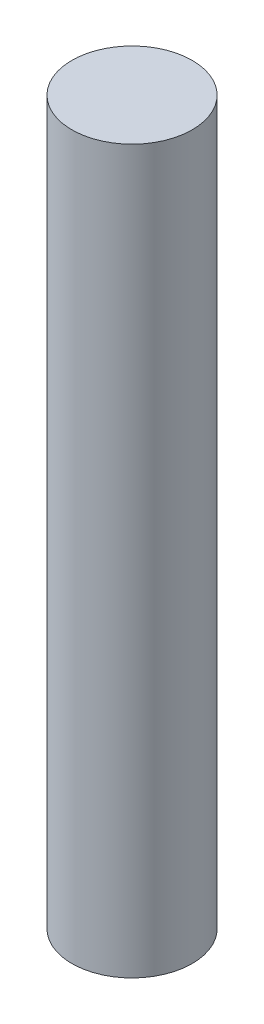
ISO-10303-21;
HEADER;
FILE_DESCRIPTION(('STEP AP214'),'2;1');
FILE_NAME('part.step','',(''),(''),'','','');
FILE_SCHEMA(('AUTOMOTIVE_DESIGN { 1 0 10303 214 1 1 1 1 }'));
ENDSEC;
DATA;
#1=APPLICATION_CONTEXT('core data for automotive mechanical design processes');
#2=APPLICATION_PROTOCOL_DEFINITION('international standard','automotive_design',2000,#1);
#3=PRODUCT_CONTEXT('',#1,'mechanical');
#4=PRODUCT('Part','Part','',(#3));
#5=PRODUCT_RELATED_PRODUCT_CATEGORY('part','',(#4));
#6=PRODUCT_DEFINITION_FORMATION('','',#4);
#7=PRODUCT_DEFINITION_CONTEXT('part definition',#1,'design');
#8=PRODUCT_DEFINITION('design','',#6,#7);
#9=PRODUCT_DEFINITION_SHAPE('','',#8);
#10=(LENGTH_UNIT() NAMED_UNIT(*) SI_UNIT(.MILLI.,.METRE.));
#11=(NAMED_UNIT(*) PLANE_ANGLE_UNIT() SI_UNIT($,.RADIAN.));
#12=(NAMED_UNIT(*) SI_UNIT($,.STERADIAN.) SOLID_ANGLE_UNIT());
#13=UNCERTAINTY_MEASURE_WITH_UNIT(LENGTH_MEASURE(1.E-05),#10,'distance_accuracy_value','');
#14=(GEOMETRIC_REPRESENTATION_CONTEXT(3) GLOBAL_UNCERTAINTY_ASSIGNED_CONTEXT((#13)) GLOBAL_UNIT_ASSIGNED_CONTEXT((#10,
#11,#12)) REPRESENTATION_CONTEXT('',''));
#15=CARTESIAN_POINT('',(0.,0.,0.));
#16=DIRECTION('',(0.,0.,1.));
#17=DIRECTION('',(1.,0.,0.));
#18=AXIS2_PLACEMENT_3D('',#15,#16,#17);
#19=CARTESIAN_POINT('',(0.,38.1,0.));
#20=DIRECTION('',(0.,-1.,0.));
#21=DIRECTION('',(0.,0.,-1.));
#22=AXIS2_PLACEMENT_3D('',#19,#20,#21);
#23=CYLINDRICAL_SURFACE('',#22,6.35);
#24=CARTESIAN_POINT('',(0.,38.1,0.));
#25=DIRECTION('',(0.,1.,0.));
#26=DIRECTION('',(0.,0.,1.));
#27=AXIS2_PLACEMENT_3D('',#24,#25,#26);
#28=CIRCLE('',#27,6.35);
#29=CARTESIAN_POINT('',(0.,38.1,-6.35));
#30=VERTEX_POINT('',#29);
#31=EDGE_CURVE('E10',#30,#30,#28,.T.);
#32=CARTESIAN_POINT('',(0.,-38.1,0.));
#33=DIRECTION('',(0.,1.,0.));
#34=DIRECTION('',(0.,0.,1.));
#35=AXIS2_PLACEMENT_3D('',#32,#33,#34);
#36=CIRCLE('',#35,6.35);
#37=CARTESIAN_POINT('',(0.,-38.1,-6.35));
#38=VERTEX_POINT('',#37);
#39=EDGE_CURVE('E40',#38,#38,#36,.T.);
#40=CARTESIAN_POINT('',(0.,38.1,-6.35));
#41=CARTESIAN_POINT('',(0.,37.30625,-6.35));
#42=CARTESIAN_POINT('',(0.,36.5125,-6.35));
#43=CARTESIAN_POINT('',(0.,34.925,-6.35));
#44=CARTESIAN_POINT('',(0.,34.13125,-6.35));
#45=CARTESIAN_POINT('',(0.,32.54375,-6.35));
#46=CARTESIAN_POINT('',(0.,31.75,-6.35));
#47=CARTESIAN_POINT('',(0.,30.1625,-6.35));
#48=CARTESIAN_POINT('',(0.,29.36875,-6.35));
#49=CARTESIAN_POINT('',(0.,27.78125,-6.35));
#50=CARTESIAN_POINT('',(0.,26.9875,-6.35));
#51=CARTESIAN_POINT('',(0.,25.4,-6.35));
#52=CARTESIAN_POINT('',(0.,24.60625,-6.35));
#53=CARTESIAN_POINT('',(0.,23.01875,-6.35));
#54=CARTESIAN_POINT('',(0.,22.225,-6.35));
#55=CARTESIAN_POINT('',(0.,20.6375,-6.35));
#56=CARTESIAN_POINT('',(0.,19.84375,-6.35));
#57=CARTESIAN_POINT('',(0.,18.25625,-6.35));
#58=CARTESIAN_POINT('',(0.,17.4625,-6.35));
#59=CARTESIAN_POINT('',(0.,15.875,-6.35));
#60=CARTESIAN_POINT('',(0.,15.08125,-6.35));
#61=CARTESIAN_POINT('',(0.,13.49375,-6.35));
#62=CARTESIAN_POINT('',(0.,12.7,-6.35));
#63=CARTESIAN_POINT('',(0.,11.1125,-6.35));
#64=CARTESIAN_POINT('',(0.,10.31875,-6.35));
#65=CARTESIAN_POINT('',(0.,8.73124999999999,-6.35));
#66=CARTESIAN_POINT('',(0.,7.93749999999999,-6.35));
#67=CARTESIAN_POINT('',(0.,6.35,-6.35));
#68=CARTESIAN_POINT('',(0.,5.55625,-6.35));
#69=CARTESIAN_POINT('',(0.,3.96875,-6.35));
#70=CARTESIAN_POINT('',(0.,3.175,-6.35));
#71=CARTESIAN_POINT('',(0.,1.5875,-6.35));
#72=CARTESIAN_POINT('',(0.,0.793750000000001,-6.35));
#73=CARTESIAN_POINT('',(0.,-0.793750000000001,-6.35));
#74=CARTESIAN_POINT('',(0.,-1.5875,-6.35));
#75=CARTESIAN_POINT('',(0.,-3.175,-6.35));
#76=CARTESIAN_POINT('',(0.,-3.96875,-6.35));
#77=CARTESIAN_POINT('',(0.,-5.55625,-6.35));
#78=CARTESIAN_POINT('',(0.,-6.35,-6.35));
#79=CARTESIAN_POINT('',(0.,-7.93750000000001,-6.35));
#80=CARTESIAN_POINT('',(0.,-8.73125,-6.35));
#81=CARTESIAN_POINT('',(0.,-10.31875,-6.35));
#82=CARTESIAN_POINT('',(0.,-11.1125,-6.35));
#83=CARTESIAN_POINT('',(0.,-12.7,-6.35));
#84=CARTESIAN_POINT('',(0.,-13.49375,-6.35));
#85=CARTESIAN_POINT('',(0.,-15.08125,-6.35));
#86=CARTESIAN_POINT('',(0.,-15.875,-6.35));
#87=CARTESIAN_POINT('',(0.,-17.4625,-6.35));
#88=CARTESIAN_POINT('',(0.,-18.25625,-6.35));
#89=CARTESIAN_POINT('',(0.,-19.84375,-6.35));
#90=CARTESIAN_POINT('',(0.,-20.6375,-6.35));
#91=CARTESIAN_POINT('',(0.,-22.225,-6.35));
#92=CARTESIAN_POINT('',(0.,-23.01875,-6.35));
#93=CARTESIAN_POINT('',(0.,-24.60625,-6.35));
#94=CARTESIAN_POINT('',(0.,-25.4,-6.35));
#95=CARTESIAN_POINT('',(0.,-26.9875,-6.35));
#96=CARTESIAN_POINT('',(0.,-27.78125,-6.35));
#97=CARTESIAN_POINT('',(0.,-29.36875,-6.35));
#98=CARTESIAN_POINT('',(0.,-30.1625,-6.35));
#99=CARTESIAN_POINT('',(0.,-31.75,-6.35));
#100=CARTESIAN_POINT('',(0.,-32.54375,-6.35));
#101=CARTESIAN_POINT('',(0.,-34.13125,-6.35));
#102=CARTESIAN_POINT('',(0.,-34.925,-6.35));
#103=CARTESIAN_POINT('',(0.,-36.5125,-6.35));
#104=CARTESIAN_POINT('',(0.,-37.30625,-6.35));
#105=CARTESIAN_POINT('',(0.,-38.1,-6.35));
#106=B_SPLINE_CURVE_WITH_KNOTS('',3,(#40,#41,#42,#43,#44,#45,#46,#47,#48,#49,#50,#51,#52,#53,
#54,#55,#56,#57,#58,#59,#60,#61,#62,#63,#64,#65,#66,#67,#68,#69,#70,#71,#72,#73,#74,#75,#76,#77,
#78,#79,#80,#81,#82,#83,#84,#85,#86,#87,#88,#89,#90,#91,#92,#93,#94,#95,#96,#97,#98,#99,#100,
#101,#102,#103,#104,#105),.UNSPECIFIED.,.F.,.F.,(4,2,2,2,2,2,2,2,2,2,2,2,2,2,2,2,2,2,2,2,2,2,2,
2,2,2,2,2,2,2,2,2,4),(0.,2.38125,4.7625,7.14375,9.52500000000001,11.90625,14.2875,16.66875,
19.05,21.43125,23.8125,26.19375,28.575,30.95625,33.3375,35.71875,38.1,40.48125,42.8625,45.24375,
47.625,50.00625,52.3875,54.76875,57.15,59.53125,61.9125,64.29375,66.675,69.05625,71.4375,
73.81875,76.2),.UNSPECIFIED.);
#107=EDGE_CURVE('BSEAM37',#30,#38,#106,.T.);
#108=ORIENTED_EDGE('',*,*,#31,.F.);
#109=ORIENTED_EDGE('',*,*,#39,.T.);
#110=ORIENTED_EDGE('',*,*,#107,.T.);
#111=ORIENTED_EDGE('',*,*,#107,.F.);
#112=EDGE_LOOP('',(#108,#110,#109,#111));
#113=FACE_BOUND('',#112,.T.);
#114=ADVANCED_FACE('F37',(#113),#23,.T.);
#115=CARTESIAN_POINT('',(0.,38.1,0.));
#116=DIRECTION('',(0.,1.,0.));
#117=DIRECTION('',(0.,0.,1.));
#118=AXIS2_PLACEMENT_3D('',#115,#116,#117);
#119=PLANE('',#118);
#120=ORIENTED_EDGE('',*,*,#31,.T.);
#121=EDGE_LOOP('',(#120));
#122=FACE_BOUND('',#121,.T.);
#123=ADVANCED_FACE('F54',(#122),#119,.T.);
#124=CARTESIAN_POINT('',(0.,-38.1,0.));
#125=DIRECTION('',(0.,1.,0.));
#126=DIRECTION('',(0.,0.,1.));
#127=AXIS2_PLACEMENT_3D('',#124,#125,#126);
#128=PLANE('',#127);
#129=ORIENTED_EDGE('',*,*,#39,.F.);
#130=EDGE_LOOP('',(#129));
#131=FACE_BOUND('',#130,.T.);
#132=ADVANCED_FACE('F52',(#131),#128,.F.);
#133=CLOSED_SHELL('',(#114,#123,#132));
#134=MANIFOLD_SOLID_BREP('B2',#133);
#135=ADVANCED_BREP_SHAPE_REPRESENTATION('',(#18,#134),#14);
#136=SHAPE_DEFINITION_REPRESENTATION(#9,#135);
ENDSEC;
END-ISO-10303-21;
